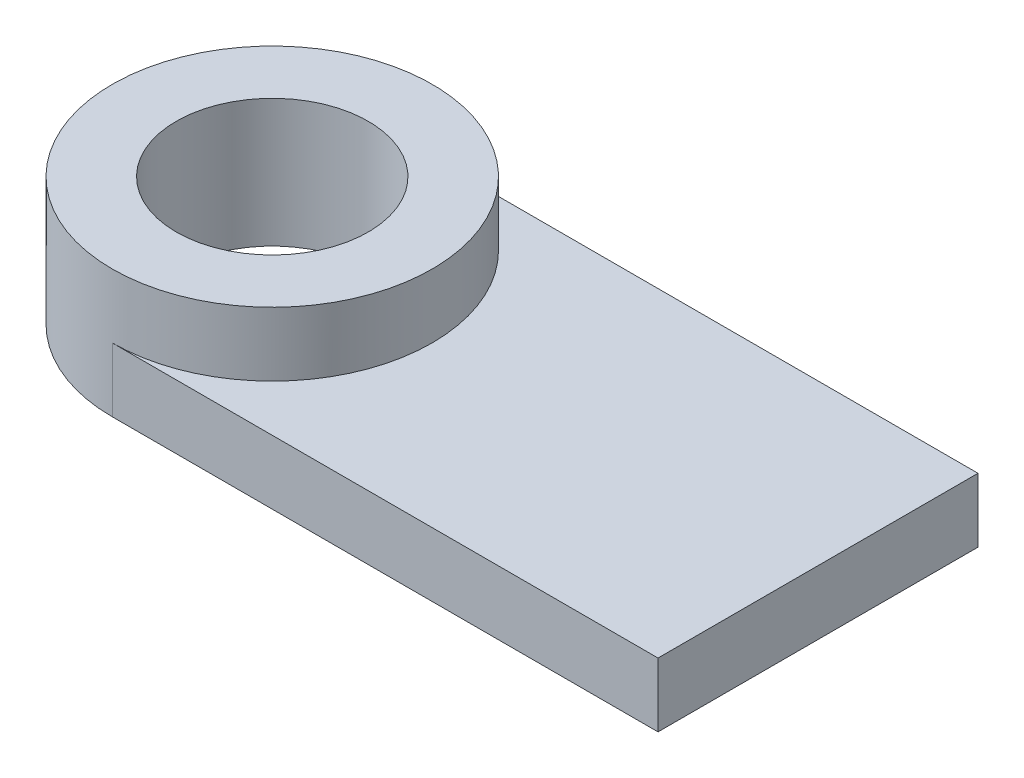
ISO-10303-21;
HEADER;
FILE_DESCRIPTION(('STEP AP214'),'2;1');
FILE_NAME('part.step','',(''),(''),'','','');
FILE_SCHEMA(('AUTOMOTIVE_DESIGN { 1 0 10303 214 1 1 1 1 }'));
ENDSEC;
DATA;
#1=APPLICATION_CONTEXT('core data for automotive mechanical design processes');
#2=APPLICATION_PROTOCOL_DEFINITION('international standard','automotive_design',2000,#1);
#3=PRODUCT_CONTEXT('',#1,'mechanical');
#4=PRODUCT('Part','Part','',(#3));
#5=PRODUCT_RELATED_PRODUCT_CATEGORY('part','',(#4));
#6=PRODUCT_DEFINITION_FORMATION('','',#4);
#7=PRODUCT_DEFINITION_CONTEXT('part definition',#1,'design');
#8=PRODUCT_DEFINITION('design','',#6,#7);
#9=PRODUCT_DEFINITION_SHAPE('','',#8);
#10=(LENGTH_UNIT() NAMED_UNIT(*) SI_UNIT(.MILLI.,.METRE.));
#11=(NAMED_UNIT(*) PLANE_ANGLE_UNIT() SI_UNIT($,.RADIAN.));
#12=(NAMED_UNIT(*) SI_UNIT($,.STERADIAN.) SOLID_ANGLE_UNIT());
#13=UNCERTAINTY_MEASURE_WITH_UNIT(LENGTH_MEASURE(1.E-05),#10,'distance_accuracy_value','');
#14=(GEOMETRIC_REPRESENTATION_CONTEXT(3) GLOBAL_UNCERTAINTY_ASSIGNED_CONTEXT((#13)) GLOBAL_UNIT_ASSIGNED_CONTEXT((#10,
#11,#12)) REPRESENTATION_CONTEXT('',''));
#15=CARTESIAN_POINT('',(0.,0.,0.));
#16=DIRECTION('',(0.,0.,1.));
#17=DIRECTION('',(1.,0.,0.));
#18=AXIS2_PLACEMENT_3D('',#15,#16,#17);
#19=CARTESIAN_POINT('',(0.,12.7,0.));
#20=DIRECTION('',(0.,-1.,0.));
#21=DIRECTION('',(0.,0.,-1.));
#22=AXIS2_PLACEMENT_3D('',#19,#20,#21);
#23=CYLINDRICAL_SURFACE('',#22,15.875);
#24=CARTESIAN_POINT('',(0.,12.7,0.));
#25=DIRECTION('',(0.,1.,0.));
#26=DIRECTION('',(0.,0.,1.));
#27=AXIS2_PLACEMENT_3D('',#24,#25,#26);
#28=CIRCLE('',#27,15.875);
#29=CARTESIAN_POINT('',(0.,12.7,15.875));
#30=VERTEX_POINT('',#29);
#31=EDGE_CURVE('E11',#30,#30,#28,.T.);
#32=ORIENTED_EDGE('',*,*,#31,.F.);
#33=EDGE_LOOP('',(#32));
#34=FACE_BOUND('',#33,.T.);
#35=DIRECTION('',(0.,-1.,0.));
#36=VECTOR('',#35,1.);
#37=CARTESIAN_POINT('',(0.,6.35,15.875));
#38=LINE('',#37,#36);
#39=CARTESIAN_POINT('',(0.,6.35,15.875));
#40=VERTEX_POINT('',#39);
#41=CARTESIAN_POINT('',(0.,0.,15.875));
#42=VERTEX_POINT('',#41);
#43=EDGE_CURVE('E68',#40,#42,#38,.T.);
#44=ORIENTED_EDGE('',*,*,#43,.F.);
#45=CARTESIAN_POINT('',(0.,6.35,0.));
#46=DIRECTION('',(0.,1.,0.));
#47=DIRECTION('',(0.,0.,1.));
#48=AXIS2_PLACEMENT_3D('',#45,#46,#47);
#49=CIRCLE('',#48,15.875);
#50=CARTESIAN_POINT('',(0.,6.35,-15.875));
#51=VERTEX_POINT('',#50);
#52=EDGE_CURVE('E63',#40,#51,#49,.T.);
#53=ORIENTED_EDGE('',*,*,#52,.T.);
#54=DIRECTION('',(0.,-1.,0.));
#55=VECTOR('',#54,1.);
#56=CARTESIAN_POINT('',(0.,6.35,-15.875));
#57=LINE('',#56,#55);
#58=CARTESIAN_POINT('',(0.,0.,-15.875));
#59=VERTEX_POINT('',#58);
#60=EDGE_CURVE('E113',#51,#59,#57,.T.);
#61=ORIENTED_EDGE('',*,*,#60,.T.);
#62=CARTESIAN_POINT('',(0.,0.,0.));
#63=DIRECTION('',(0.,1.,0.));
#64=DIRECTION('',(0.,0.,1.));
#65=AXIS2_PLACEMENT_3D('',#62,#63,#64);
#66=CIRCLE('',#65,15.875);
#67=EDGE_CURVE('E49',#59,#42,#66,.T.);
#68=ORIENTED_EDGE('',*,*,#67,.T.);
#69=EDGE_LOOP('',(#44,#53,#61,#68));
#70=FACE_BOUND('',#69,.T.);
#71=ADVANCED_FACE('F45',(#34,#70),#23,.T.);
#72=CARTESIAN_POINT('',(0.,12.7,0.));
#73=DIRECTION('',(0.,-1.,0.));
#74=DIRECTION('',(0.,0.,-1.));
#75=AXIS2_PLACEMENT_3D('',#72,#73,#74);
#76=CYLINDRICAL_SURFACE('',#75,9.52500000000002);
#77=CARTESIAN_POINT('',(0.,12.7,0.));
#78=DIRECTION('',(0.,1.,0.));
#79=DIRECTION('',(0.,0.,1.));
#80=AXIS2_PLACEMENT_3D('',#77,#78,#79);
#81=CIRCLE('',#80,9.52500000000002);
#82=CARTESIAN_POINT('',(0.,12.7,9.52500000000002));
#83=VERTEX_POINT('',#82);
#84=EDGE_CURVE('E55',#83,#83,#81,.T.);
#85=ORIENTED_EDGE('',*,*,#84,.T.);
#86=EDGE_LOOP('',(#85));
#87=FACE_BOUND('',#86,.T.);
#88=CARTESIAN_POINT('',(0.,0.,0.));
#89=DIRECTION('',(0.,1.,0.));
#90=DIRECTION('',(0.,0.,1.));
#91=AXIS2_PLACEMENT_3D('',#88,#89,#90);
#92=CIRCLE('',#91,9.52500000000002);
#93=CARTESIAN_POINT('',(0.,0.,9.52500000000002));
#94=VERTEX_POINT('',#93);
#95=EDGE_CURVE('E132',#94,#94,#92,.T.);
#96=ORIENTED_EDGE('',*,*,#95,.F.);
#97=EDGE_LOOP('',(#96));
#98=FACE_BOUND('',#97,.T.);
#99=ADVANCED_FACE('F47',(#87,#98),#76,.F.);
#100=CARTESIAN_POINT('',(0.,12.7,0.));
#101=DIRECTION('',(0.,1.,0.));
#102=DIRECTION('',(0.,0.,1.));
#103=AXIS2_PLACEMENT_3D('',#100,#101,#102);
#104=PLANE('',#103);
#105=ORIENTED_EDGE('',*,*,#84,.F.);
#106=EDGE_LOOP('',(#105));
#107=FACE_BOUND('',#106,.T.);
#108=ORIENTED_EDGE('',*,*,#31,.T.);
#109=EDGE_LOOP('',(#108));
#110=FACE_BOUND('',#109,.T.);
#111=ADVANCED_FACE('F161',(#107,#110),#104,.T.);
#112=CARTESIAN_POINT('',(0.,0.,0.));
#113=DIRECTION('',(0.,1.,0.));
#114=DIRECTION('',(0.,0.,1.));
#115=AXIS2_PLACEMENT_3D('',#112,#113,#114);
#116=PLANE('',#115);
#117=ORIENTED_EDGE('',*,*,#95,.T.);
#118=EDGE_LOOP('',(#117));
#119=FACE_BOUND('',#118,.T.);
#120=ORIENTED_EDGE('',*,*,#67,.F.);
#121=DIRECTION('',(-1.,0.,0.));
#122=VECTOR('',#121,1.);
#123=CARTESIAN_POINT('',(0.,0.,-15.875));
#124=LINE('',#123,#122);
#125=CARTESIAN_POINT('',(54.1545750139669,0.,-15.875));
#126=VERTEX_POINT('',#125);
#127=EDGE_CURVE('E122',#126,#59,#124,.T.);
#128=ORIENTED_EDGE('',*,*,#127,.F.);
#129=DIRECTION('',(0.,0.,-1.));
#130=VECTOR('',#129,1.);
#131=CARTESIAN_POINT('',(54.1545750139669,0.,0.));
#132=LINE('',#131,#130);
#133=CARTESIAN_POINT('',(54.1545750139669,0.,15.875));
#134=VERTEX_POINT('',#133);
#135=EDGE_CURVE('E119',#134,#126,#132,.T.);
#136=ORIENTED_EDGE('',*,*,#135,.F.);
#137=DIRECTION('',(1.,0.,0.));
#138=VECTOR('',#137,1.);
#139=CARTESIAN_POINT('',(0.,0.,15.875));
#140=LINE('',#139,#138);
#141=EDGE_CURVE('E100',#42,#134,#140,.T.);
#142=ORIENTED_EDGE('',*,*,#141,.F.);
#143=EDGE_LOOP('',(#120,#128,#136,#142));
#144=FACE_BOUND('',#143,.T.);
#145=ADVANCED_FACE('F143',(#119,#144),#116,.F.);
#146=CARTESIAN_POINT('',(0.,6.35,15.875));
#147=DIRECTION('',(0.,0.,-1.));
#148=DIRECTION('',(-1.,0.,0.));
#149=AXIS2_PLACEMENT_3D('',#146,#147,#148);
#150=PLANE('',#149);
#151=ORIENTED_EDGE('',*,*,#141,.T.);
#152=DIRECTION('',(0.,-1.,0.));
#153=VECTOR('',#152,1.);
#154=CARTESIAN_POINT('',(54.1545750139669,6.35,15.875));
#155=LINE('',#154,#153);
#156=CARTESIAN_POINT('',(54.1545750139669,6.35,15.875));
#157=VERTEX_POINT('',#156);
#158=EDGE_CURVE('E97',#157,#134,#155,.T.);
#159=ORIENTED_EDGE('',*,*,#158,.F.);
#160=DIRECTION('',(1.,0.,0.));
#161=VECTOR('',#160,1.);
#162=CARTESIAN_POINT('',(0.,6.35,15.875));
#163=LINE('',#162,#161);
#164=EDGE_CURVE('E87',#40,#157,#163,.T.);
#165=ORIENTED_EDGE('',*,*,#164,.F.);
#166=ORIENTED_EDGE('',*,*,#43,.T.);
#167=EDGE_LOOP('',(#151,#159,#165,#166));
#168=FACE_BOUND('',#167,.T.);
#169=ADVANCED_FACE('F98',(#168),#150,.F.);
#170=CARTESIAN_POINT('',(54.1545750139669,6.35,0.));
#171=DIRECTION('',(-1.,0.,0.));
#172=DIRECTION('',(0.,0.,1.));
#173=AXIS2_PLACEMENT_3D('',#170,#171,#172);
#174=PLANE('',#173);
#175=ORIENTED_EDGE('',*,*,#135,.T.);
#176=DIRECTION('',(0.,-1.,0.));
#177=VECTOR('',#176,1.);
#178=CARTESIAN_POINT('',(54.1545750139669,6.35,-15.875));
#179=LINE('',#178,#177);
#180=CARTESIAN_POINT('',(54.1545750139669,6.35,-15.875));
#181=VERTEX_POINT('',#180);
#182=EDGE_CURVE('E104',#181,#126,#179,.T.);
#183=ORIENTED_EDGE('',*,*,#182,.F.);
#184=DIRECTION('',(0.,0.,-1.));
#185=VECTOR('',#184,1.);
#186=CARTESIAN_POINT('',(54.1545750139669,6.35,0.));
#187=LINE('',#186,#185);
#188=EDGE_CURVE('E91',#157,#181,#187,.T.);
#189=ORIENTED_EDGE('',*,*,#188,.F.);
#190=ORIENTED_EDGE('',*,*,#158,.T.);
#191=EDGE_LOOP('',(#175,#183,#189,#190));
#192=FACE_BOUND('',#191,.T.);
#193=ADVANCED_FACE('F106',(#192),#174,.F.);
#194=CARTESIAN_POINT('',(0.,6.35,-15.875));
#195=DIRECTION('',(0.,0.,1.));
#196=DIRECTION('',(1.,0.,0.));
#197=AXIS2_PLACEMENT_3D('',#194,#195,#196);
#198=PLANE('',#197);
#199=ORIENTED_EDGE('',*,*,#127,.T.);
#200=ORIENTED_EDGE('',*,*,#60,.F.);
#201=DIRECTION('',(-1.,0.,0.));
#202=VECTOR('',#201,1.);
#203=CARTESIAN_POINT('',(0.,6.35,-15.875));
#204=LINE('',#203,#202);
#205=EDGE_CURVE('E110',#181,#51,#204,.T.);
#206=ORIENTED_EDGE('',*,*,#205,.F.);
#207=ORIENTED_EDGE('',*,*,#182,.T.);
#208=EDGE_LOOP('',(#199,#200,#206,#207));
#209=FACE_BOUND('',#208,.T.);
#210=ADVANCED_FACE('F145',(#209),#198,.F.);
#211=CARTESIAN_POINT('',(0.,6.35,0.));
#212=DIRECTION('',(0.,1.,0.));
#213=DIRECTION('',(0.,0.,1.));
#214=AXIS2_PLACEMENT_3D('',#211,#212,#213);
#215=PLANE('',#214);
#216=ORIENTED_EDGE('',*,*,#52,.F.);
#217=ORIENTED_EDGE('',*,*,#164,.T.);
#218=ORIENTED_EDGE('',*,*,#188,.T.);
#219=ORIENTED_EDGE('',*,*,#205,.T.);
#220=EDGE_LOOP('',(#216,#217,#218,#219));
#221=FACE_BOUND('',#220,.T.);
#222=ADVANCED_FACE('F89',(#221),#215,.T.);
#223=CLOSED_SHELL('',(#71,#99,#111,#145,#169,#193,#210,#222));
#224=MANIFOLD_SOLID_BREP('B2',#223);
#225=ADVANCED_BREP_SHAPE_REPRESENTATION('',(#18,#224),#14);
#226=SHAPE_DEFINITION_REPRESENTATION(#9,#225);
ENDSEC;
END-ISO-10303-21;
